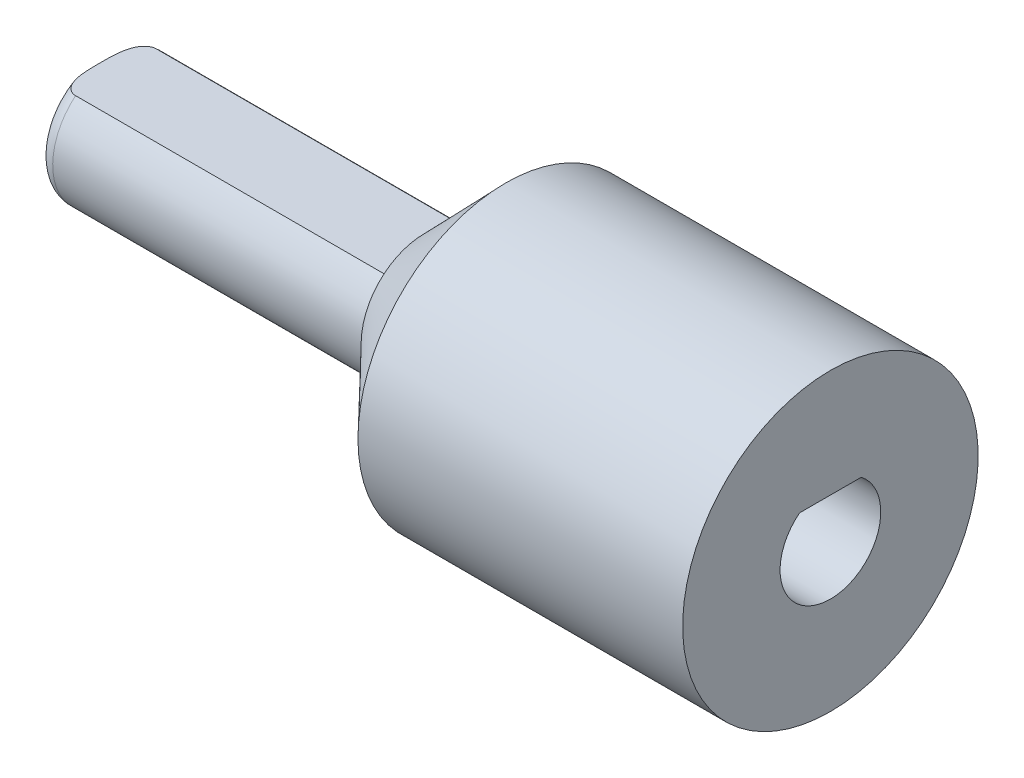
ISO-10303-21;
HEADER;
FILE_DESCRIPTION(('STEP AP214'),'2;1');
FILE_NAME('part.step','',(''),(''),'','','');
FILE_SCHEMA(('AUTOMOTIVE_DESIGN { 1 0 10303 214 1 1 1 1 }'));
ENDSEC;
DATA;
#1=APPLICATION_CONTEXT('core data for automotive mechanical design processes');
#2=APPLICATION_PROTOCOL_DEFINITION('international standard','automotive_design',2000,#1);
#3=PRODUCT_CONTEXT('',#1,'mechanical');
#4=PRODUCT('Part','Part','',(#3));
#5=PRODUCT_RELATED_PRODUCT_CATEGORY('part','',(#4));
#6=PRODUCT_DEFINITION_FORMATION('','',#4);
#7=PRODUCT_DEFINITION_CONTEXT('part definition',#1,'design');
#8=PRODUCT_DEFINITION('design','',#6,#7);
#9=PRODUCT_DEFINITION_SHAPE('','',#8);
#10=(LENGTH_UNIT() NAMED_UNIT(*) SI_UNIT(.MILLI.,.METRE.));
#11=(NAMED_UNIT(*) PLANE_ANGLE_UNIT() SI_UNIT($,.RADIAN.));
#12=(NAMED_UNIT(*) SI_UNIT($,.STERADIAN.) SOLID_ANGLE_UNIT());
#13=UNCERTAINTY_MEASURE_WITH_UNIT(LENGTH_MEASURE(1.E-05),#10,'distance_accuracy_value','');
#14=(GEOMETRIC_REPRESENTATION_CONTEXT(3) GLOBAL_UNCERTAINTY_ASSIGNED_CONTEXT((#13)) GLOBAL_UNIT_ASSIGNED_CONTEXT((#10,
#11,#12)) REPRESENTATION_CONTEXT('',''));
#15=CARTESIAN_POINT('',(0.,0.,0.));
#16=DIRECTION('',(0.,0.,1.));
#17=DIRECTION('',(1.,0.,0.));
#18=AXIS2_PLACEMENT_3D('',#15,#16,#17);
#19=CARTESIAN_POINT('',(30.,0.,0.));
#20=DIRECTION('',(1.,0.,0.));
#21=DIRECTION('',(0.,1.,0.));
#22=AXIS2_PLACEMENT_3D('',#19,#20,#21);
#23=CYLINDRICAL_SURFACE('',#22,9.1);
#24=CARTESIAN_POINT('',(25.,0.,0.));
#25=DIRECTION('',(-1.,0.,0.));
#26=DIRECTION('',(0.,0.,1.));
#27=AXIS2_PLACEMENT_3D('',#24,#25,#26);
#28=CIRCLE('',#27,9.1);
#29=CARTESIAN_POINT('',(25.,0.,9.1));
#30=VERTEX_POINT('',#29);
#31=EDGE_CURVE('E103',#30,#30,#28,.T.);
#32=ORIENTED_EDGE('',*,*,#31,.F.);
#33=EDGE_LOOP('',(#32));
#34=FACE_BOUND('',#33,.T.);
#35=CARTESIAN_POINT('',(45.,0.,0.));
#36=DIRECTION('',(1.,0.,0.));
#37=DIRECTION('',(0.,1.,0.));
#38=AXIS2_PLACEMENT_3D('',#35,#36,#37);
#39=CIRCLE('',#38,9.1);
#40=CARTESIAN_POINT('',(45.,9.1,0.));
#41=VERTEX_POINT('',#40);
#42=EDGE_CURVE('E112',#41,#41,#39,.T.);
#43=ORIENTED_EDGE('',*,*,#42,.F.);
#44=EDGE_LOOP('',(#43));
#45=FACE_BOUND('',#44,.T.);
#46=ADVANCED_FACE('F36',(#34,#45),#23,.T.);
#47=CARTESIAN_POINT('',(45.,9.1,0.));
#48=DIRECTION('',(1.,0.,0.));
#49=DIRECTION('',(0.,1.,0.));
#50=AXIS2_PLACEMENT_3D('',#47,#48,#49);
#51=PLANE('',#50);
#52=ORIENTED_EDGE('',*,*,#42,.T.);
#53=EDGE_LOOP('',(#52));
#54=FACE_BOUND('',#53,.T.);
#55=CARTESIAN_POINT('',(45.,0.,0.));
#56=DIRECTION('',(1.,0.,0.));
#57=DIRECTION('',(0.,1.,0.));
#58=AXIS2_PLACEMENT_3D('',#55,#56,#57);
#59=CIRCLE('',#58,3.1);
#60=CARTESIAN_POINT('',(45.,2.45,1.89934199132226));
#61=VERTEX_POINT('',#60);
#62=CARTESIAN_POINT('',(45.,2.45,-1.89934199132226));
#63=VERTEX_POINT('',#62);
#64=EDGE_CURVE('E110',#61,#63,#59,.T.);
#65=ORIENTED_EDGE('',*,*,#64,.F.);
#66=DIRECTION('',(0.,0.,-1.));
#67=VECTOR('',#66,1.);
#68=CARTESIAN_POINT('',(45.,2.45,0.));
#69=LINE('',#68,#67);
#70=EDGE_CURVE('E233',#61,#63,#69,.T.);
#71=ORIENTED_EDGE('',*,*,#70,.T.);
#72=EDGE_LOOP('',(#65,#71));
#73=FACE_BOUND('',#72,.T.);
#74=ADVANCED_FACE('F135',(#54,#73),#51,.T.);
#75=CARTESIAN_POINT('',(30.,0.,0.));
#76=DIRECTION('',(1.,0.,0.));
#77=DIRECTION('',(0.,1.,0.));
#78=AXIS2_PLACEMENT_3D('',#75,#76,#77);
#79=CYLINDRICAL_SURFACE('',#78,3.1);
#80=DIRECTION('',(1.,0.,0.));
#81=VECTOR('',#80,1.);
#82=CARTESIAN_POINT('',(30.,2.45,-1.89934199132226));
#83=LINE('',#82,#81);
#84=CARTESIAN_POINT('',(32.,2.45,-1.89934199132226));
#85=VERTEX_POINT('',#84);
#86=EDGE_CURVE('E105',#85,#63,#83,.T.);
#87=ORIENTED_EDGE('',*,*,#86,.F.);
#88=CARTESIAN_POINT('',(32.,0.,0.));
#89=DIRECTION('',(1.,0.,0.));
#90=DIRECTION('',(0.,1.,0.));
#91=AXIS2_PLACEMENT_3D('',#88,#89,#90);
#92=CIRCLE('',#91,3.1);
#93=CARTESIAN_POINT('',(32.,2.45,1.89934199132226));
#94=VERTEX_POINT('',#93);
#95=EDGE_CURVE('E86',#94,#85,#92,.T.);
#96=ORIENTED_EDGE('',*,*,#95,.F.);
#97=DIRECTION('',(1.,0.,0.));
#98=VECTOR('',#97,1.);
#99=CARTESIAN_POINT('',(30.,2.45,1.89934199132226));
#100=LINE('',#99,#98);
#101=EDGE_CURVE('E230',#94,#61,#100,.T.);
#102=ORIENTED_EDGE('',*,*,#101,.T.);
#103=ORIENTED_EDGE('',*,*,#64,.T.);
#104=EDGE_LOOP('',(#87,#96,#102,#103));
#105=FACE_BOUND('',#104,.T.);
#106=ADVANCED_FACE('F131',(#105),#79,.F.);
#107=CARTESIAN_POINT('',(30.,0.,0.));
#108=DIRECTION('',(1.,0.,0.));
#109=DIRECTION('',(0.,1.,0.));
#110=AXIS2_PLACEMENT_3D('',#107,#108,#109);
#111=CONICAL_SURFACE('',#110,0.,0.99783018390619);
#112=CARTESIAN_POINT('',(33.0822640835354,2.45,-4.10147478271747));
#113=CARTESIAN_POINT('',(33.0222688677766,2.45,-3.99312986839187));
#114=CARTESIAN_POINT('',(32.9627306009875,2.45,-3.8845282987026));
#115=CARTESIAN_POINT('',(32.8448205756611,2.45,-3.6666756285392));
#116=CARTESIAN_POINT('',(32.7864489735671,2.45,-3.55742444347025));
#117=CARTESIAN_POINT('',(32.6708557619406,2.45,-3.33762271938319));
#118=CARTESIAN_POINT('',(32.6136412709603,2.45,-3.22706842601533));
#119=CARTESIAN_POINT('',(32.5010341367918,2.45,-3.00503961424674));
#120=CARTESIAN_POINT('',(32.4456414122943,2.45,-2.89356513719434));
#121=CARTESIAN_POINT('',(32.3342808959826,2.45,-2.66354856217289));
#122=CARTESIAN_POINT('',(32.278438649272,2.45,-2.54494539399226));
#123=CARTESIAN_POINT('',(32.1700719990868,2.45,-2.30620559226578));
#124=CARTESIAN_POINT('',(32.1175480102689,2.45,-2.18606876931704));
#125=CARTESIAN_POINT('',(32.0169715815761,2.45,-1.94417832466583));
#126=CARTESIAN_POINT('',(31.9689111702574,2.45,-1.82242804693643));
#127=CARTESIAN_POINT('',(31.878589653929,2.45,-1.57681280661028));
#128=CARTESIAN_POINT('',(31.8363266591773,2.45,-1.4529485479665));
#129=CARTESIAN_POINT('',(31.7597812932428,2.45,-1.20395056942792));
#130=CARTESIAN_POINT('',(31.725430859707,2.45,-1.078838143254));
#131=CARTESIAN_POINT('',(31.6664026914298,2.45,-0.826324571779752));
#132=CARTESIAN_POINT('',(31.6417228047462,2.45,-0.698923942269424));
#133=CARTESIAN_POINT('',(31.6045231123367,2.45,-0.444676455427156));
#134=CARTESIAN_POINT('',(31.5917902181542,2.45,-0.317861701479688));
#135=CARTESIAN_POINT('',(31.5790642068831,2.45,-0.0635809316517888));
#136=CARTESIAN_POINT('',(31.5790700608916,2.45,0.0638850307992146));
#137=CARTESIAN_POINT('',(31.5916066020238,2.45,0.31401105716441));
#138=CARTESIAN_POINT('',(31.6037293193037,2.45,0.436692424349663));
#139=CARTESIAN_POINT('',(31.6386863915768,2.45,0.680494355124752));
#140=CARTESIAN_POINT('',(31.6615224924699,2.45,0.801614661010436));
#141=CARTESIAN_POINT('',(31.7166878493983,2.45,1.04448136496026));
#142=CARTESIAN_POINT('',(31.7492177589699,2.45,1.16618131676199));
#143=CARTESIAN_POINT('',(31.8034757304785,2.45,1.34704782635168));
#144=CARTESIAN_POINT('',(31.8224730282286,2.45,1.40705824269581));
#145=CARTESIAN_POINT('',(31.8620715478989,2.45,1.52654442864439));
#146=CARTESIAN_POINT('',(31.8826726707678,2.45,1.58602023101365));
#147=CARTESIAN_POINT('',(31.9527901085688,2.45,1.78098246293056));
#148=CARTESIAN_POINT('',(32.0052785289622,2.45,1.91540144127997));
#149=CARTESIAN_POINT('',(32.1156276473026,2.45,2.18202911662332));
#150=CARTESIAN_POINT('',(32.173490079192,2.45,2.31423708387693));
#151=CARTESIAN_POINT('',(32.2932459991395,2.45,2.57698302872711));
#152=CARTESIAN_POINT('',(32.3551439214728,2.45,2.70751897408673));
#153=CARTESIAN_POINT('',(32.4819078590821,2.45,2.96711409808928));
#154=CARTESIAN_POINT('',(32.5467735253491,2.45,3.09617344816079));
#155=CARTESIAN_POINT('',(32.6790677365007,2.45,3.35370051962677));
#156=CARTESIAN_POINT('',(32.746506478066,2.45,3.48216298536282));
#157=CARTESIAN_POINT('',(32.8831604194306,2.45,3.73814112019863));
#158=CARTESIAN_POINT('',(32.9523756667965,2.45,3.86565676382887));
#159=CARTESIAN_POINT('',(33.1620057351369,2.45,4.2469006947162));
#160=CARTESIAN_POINT('',(33.3044903683454,2.45,4.49948978674318));
#161=CARTESIAN_POINT('',(33.5742555844649,2.45,4.96991913905333));
#162=CARTESIAN_POINT('',(33.7011050416119,2.45,5.18800847034171));
#163=CARTESIAN_POINT('',(33.9567648838639,2.45,5.62308489450393));
#164=CARTESIAN_POINT('',(34.0855756042172,2.45,5.84007179028362));
#165=CARTESIAN_POINT('',(34.3434867978673,2.45,6.27130493320179));
#166=CARTESIAN_POINT('',(34.4725749366151,2.45,6.48555857396541));
#167=CARTESIAN_POINT('',(34.73180419028,2.45,6.91336786895846));
#168=CARTESIAN_POINT('',(34.8619450826231,2.45,7.12692365798186));
#169=CARTESIAN_POINT('',(34.9924679583633,2.45,7.34024379686871));
#170=B_SPLINE_CURVE_WITH_KNOTS('',3,(#112,#113,#114,#115,#116,#117,#118,#119,#120,#121,#122,
#123,#124,#125,#126,#127,#128,#129,#130,#131,#132,#133,#134,#135,#136,#137,#138,#139,#140,#141,
#142,#143,#144,#145,#146,#147,#148,#149,#150,#151,#152,#153,#154,#155,#156,#157,#158,#159,#160,
#161,#162,#163,#164,#165,#166,#167,#168,#169),.UNSPECIFIED.,.F.,.F.,(4,2,2,2,2,2,2,2,2,2,2,2,2,
2,2,2,2,2,2,2,2,2,2,2,2,2,2,2,4),(0.,0.371544220243284,0.743137932664901,1.11657013896955,
1.48998565550802,1.88322216822695,2.27650772382364,2.66907683766718,3.06151768295924,
3.45044503407035,3.83928578976136,4.22105137183573,4.60278611888081,4.97208685640307,
5.3414477977075,5.71905910247918,5.90787847437289,6.09668619412545,6.52941492948073,
6.96228377446339,7.39563655329309,7.8289384998656,8.26418532763144,8.69944382142602,
9.56940663931012,10.3262877546752,11.0832997331682,11.8337065858408,12.5839587306215),.UNSPECIFIED.);
#171=EDGE_CURVE('E115',#94,#85,#170,.F.);
#172=ORIENTED_EDGE('',*,*,#171,.F.);
#173=ORIENTED_EDGE('',*,*,#95,.T.);
#174=EDGE_LOOP('',(#172,#173));
#175=FACE_BOUND('',#174,.T.);
#176=CARTESIAN_POINT('',(30.,0.,0.));
#177=VERTEX_POINT('',#176);
#178=VERTEX_LOOP('',#177);
#179=FACE_BOUND('',#178,.T.);
#180=ADVANCED_FACE('F127',(#175,#179),#111,.F.);
#181=CARTESIAN_POINT('',(25.,0.,0.));
#182=DIRECTION('',(1.,0.,0.));
#183=DIRECTION('',(0.,0.,-1.));
#184=AXIS2_PLACEMENT_3D('',#181,#182,#183);
#185=CONICAL_SURFACE('',#184,9.1,0.805003494254653);
#186=CARTESIAN_POINT('',(20.,0.,0.));
#187=DIRECTION('',(-1.,0.,0.));
#188=DIRECTION('',(0.,0.,1.));
#189=AXIS2_PLACEMENT_3D('',#186,#187,#188);
#190=CIRCLE('',#189,3.9);
#191=CARTESIAN_POINT('',(20.,3.,2.49198715887542));
#192=VERTEX_POINT('',#191);
#193=CARTESIAN_POINT('',(20.,3.,-2.49198715887542));
#194=VERTEX_POINT('',#193);
#195=EDGE_CURVE('E80',#192,#194,#190,.T.);
#196=ORIENTED_EDGE('',*,*,#195,.F.);
#197=EDGE_CURVE('E87',#194,#192,#190,.T.);
#198=ORIENTED_EDGE('',*,*,#197,.F.);
#199=EDGE_LOOP('',(#196,#198));
#200=FACE_BOUND('',#199,.T.);
#201=ORIENTED_EDGE('',*,*,#31,.T.);
#202=EDGE_LOOP('',(#201));
#203=FACE_BOUND('',#202,.T.);
#204=ADVANCED_FACE('F101',(#200,#203),#185,.T.);
#205=CARTESIAN_POINT('',(0.,0.,0.));
#206=DIRECTION('',(-1.,0.,0.));
#207=DIRECTION('',(0.,-1.,0.));
#208=AXIS2_PLACEMENT_3D('',#205,#206,#207);
#209=PLANE('',#208);
#210=CARTESIAN_POINT('',(0.,0.,0.));
#211=DIRECTION('',(-1.,0.,0.));
#212=DIRECTION('',(0.,-1.,0.));
#213=AXIS2_PLACEMENT_3D('',#210,#211,#212);
#214=CIRCLE('',#213,2.9);
#215=CARTESIAN_POINT('',(0.,2.23076923076923,1.85301609249711));
#216=VERTEX_POINT('',#215);
#217=EDGE_CURVE('E12',#216,#216,#214,.T.);
#218=ORIENTED_EDGE('',*,*,#217,.T.);
#219=EDGE_LOOP('',(#218));
#220=FACE_BOUND('',#219,.T.);
#221=ADVANCED_FACE('F144',(#220),#209,.T.);
#222=CARTESIAN_POINT('',(30.,0.,0.));
#223=DIRECTION('',(1.,0.,0.));
#224=DIRECTION('',(0.,1.,0.));
#225=AXIS2_PLACEMENT_3D('',#222,#223,#224);
#226=CYLINDRICAL_SURFACE('',#225,3.9);
#227=DIRECTION('',(-1.,0.,0.));
#228=VECTOR('',#227,1.);
#229=CARTESIAN_POINT('',(20.,3.,2.49198715887542));
#230=LINE('',#229,#228);
#231=CARTESIAN_POINT('',(1.00000000000001,3.,2.49198715887542));
#232=VERTEX_POINT('',#231);
#233=EDGE_CURVE('E92',#192,#232,#230,.T.);
#234=ORIENTED_EDGE('',*,*,#233,.T.);
#235=CARTESIAN_POINT('',(1.,0.,0.));
#236=DIRECTION('',(-1.,0.,0.));
#237=DIRECTION('',(0.,-1.,0.));
#238=AXIS2_PLACEMENT_3D('',#235,#236,#237);
#239=CIRCLE('',#238,3.9);
#240=CARTESIAN_POINT('',(1.,3.,-2.49198715887542));
#241=VERTEX_POINT('',#240);
#242=EDGE_CURVE('E99',#232,#241,#239,.F.);
#243=ORIENTED_EDGE('',*,*,#242,.T.);
#244=DIRECTION('',(-1.,0.,0.));
#245=VECTOR('',#244,1.);
#246=CARTESIAN_POINT('',(20.,3.,-2.49198715887542));
#247=LINE('',#246,#245);
#248=EDGE_CURVE('E91',#194,#241,#247,.T.);
#249=ORIENTED_EDGE('',*,*,#248,.F.);
#250=ORIENTED_EDGE('',*,*,#197,.T.);
#251=EDGE_LOOP('',(#234,#243,#249,#250));
#252=FACE_BOUND('',#251,.T.);
#253=ADVANCED_FACE('F97',(#252),#226,.T.);
#254=CARTESIAN_POINT('',(30.,2.45,0.));
#255=DIRECTION('',(0.,-1.,0.));
#256=DIRECTION('',(1.,0.,0.));
#257=AXIS2_PLACEMENT_3D('',#254,#255,#256);
#258=PLANE('',#257);
#259=ORIENTED_EDGE('',*,*,#101,.F.);
#260=ORIENTED_EDGE('',*,*,#171,.T.);
#261=ORIENTED_EDGE('',*,*,#86,.T.);
#262=ORIENTED_EDGE('',*,*,#70,.F.);
#263=EDGE_LOOP('',(#259,#260,#261,#262));
#264=FACE_BOUND('',#263,.T.);
#265=ADVANCED_FACE('F123',(#264),#258,.T.);
#266=CARTESIAN_POINT('',(20.,3.,0.));
#267=DIRECTION('',(0.,-1.,0.));
#268=DIRECTION('',(1.,0.,0.));
#269=AXIS2_PLACEMENT_3D('',#266,#267,#268);
#270=PLANE('',#269);
#271=ORIENTED_EDGE('',*,*,#248,.T.);
#272=CARTESIAN_POINT('',(1.,3.,-2.49198715887542));
#273=CARTESIAN_POINT('',(0.979437917066557,3.,-2.49199074908237));
#274=CARTESIAN_POINT('',(0.958888814998611,3.,-2.49099373140729));
#275=CARTESIAN_POINT('',(0.917994865450589,3.,-2.48704238105869));
#276=CARTESIAN_POINT('',(0.897649875785505,3.,-2.48408952317974));
#277=CARTESIAN_POINT('',(0.837544087010761,3.,-2.4724386741567));
#278=CARTESIAN_POINT('',(0.798295967720155,3.,-2.4609463788786));
#279=CARTESIAN_POINT('',(0.722548844750251,3.,-2.43137022451434));
#280=CARTESIAN_POINT('',(0.686043176827645,3.,-2.4133030119175));
#281=CARTESIAN_POINT('',(0.61625472921864,3.,-2.37164690432703));
#282=CARTESIAN_POINT('',(0.582980294444992,3.,-2.34804422312281));
#283=CARTESIAN_POINT('',(0.50771551307762,3.,-2.2863447218251));
#284=CARTESIAN_POINT('',(0.467415212093755,3.,-2.24619160640654));
#285=CARTESIAN_POINT('',(0.393774021944655,3.,-2.1600346337248));
#286=CARTESIAN_POINT('',(0.360441064096966,3.,-2.1140242035503));
#287=CARTESIAN_POINT('',(0.283263395287344,3.,-1.99130997148751));
#288=CARTESIAN_POINT('',(0.243910917939652,3.,-1.9117891040102));
#289=CARTESIAN_POINT('',(0.194127269269301,3.,-1.78892001673169));
#290=CARTESIAN_POINT('',(0.179053748581202,3.,-1.74728303542987));
#291=CARTESIAN_POINT('',(0.151620527749575,3.,-1.66314386708564));
#292=CARTESIAN_POINT('',(0.139258898604387,3.,-1.62064231868932));
#293=CARTESIAN_POINT('',(0.105803959623038,3.,-1.49267822291249));
#294=CARTESIAN_POINT('',(0.0881733722749255,3.,-1.40631769721909));
#295=CARTESIAN_POINT('',(0.059656156136683,3.,-1.23246194549841));
#296=CARTESIAN_POINT('',(0.0487783321822203,3.,-1.14496538925196));
#297=CARTESIAN_POINT('',(0.0316743111337259,3.,-0.969109733775322));
#298=CARTESIAN_POINT('',(0.0254713470900518,3.,-0.880748508809643));
#299=CARTESIAN_POINT('',(0.0161169494450636,3.,-0.703924434876694));
#300=CARTESIAN_POINT('',(0.0129641059901421,3.,-0.615461651802371));
#301=CARTESIAN_POINT('',(0.00842194096114439,3.,-0.437518731346362));
#302=CARTESIAN_POINT('',(0.00705249630878828,3.,-0.348038156302517));
#303=CARTESIAN_POINT('',(0.00533366615670855,3.,-0.169060768438579));
#304=CARTESIAN_POINT('',(0.00498437851648339,3.,-0.0795639548842401));
#305=CARTESIAN_POINT('',(0.00504397578743107,3.,0.099198592781009));
#306=CARTESIAN_POINT('',(0.00545090711784649,3.,0.188464327405021));
#307=CARTESIAN_POINT('',(0.00731992079293353,3.,0.366980738617853));
#308=CARTESIAN_POINT('',(0.00878192798468802,3.,0.456231415826332));
#309=CARTESIAN_POINT('',(0.0135574955979064,3.,0.633138430933189));
#310=CARTESIAN_POINT('',(0.0168384486940873,3.,0.720795530319391));
#311=CARTESIAN_POINT('',(0.0264853263207332,3.,0.896031155333023));
#312=CARTESIAN_POINT('',(0.0328538048787363,3.,0.983609555665509));
#313=CARTESIAN_POINT('',(0.050266840890535,3.,1.15751748061158));
#314=CARTESIAN_POINT('',(0.0612679354359268,3.,1.24385108947597));
#315=CARTESIAN_POINT('',(0.0899463218150543,3.,1.41536688968294));
#316=CARTESIAN_POINT('',(0.107615081971484,3.,1.50055040896489));
#317=CARTESIAN_POINT('',(0.146669231095486,3.,1.64820346348317));
#318=CARTESIAN_POINT('',(0.166116650863163,3.,1.71117536728164));
#319=CARTESIAN_POINT('',(0.211520968555934,3.,1.83497495196133));
#320=CARTESIAN_POINT('',(0.237494329621938,3.,1.89579675928035));
#321=CARTESIAN_POINT('',(0.297524247389423,3.,2.01417228668545));
#322=CARTESIAN_POINT('',(0.33165944793902,3.,2.07168700086469));
#323=CARTESIAN_POINT('',(0.409094770325379,3.,2.18018334756639));
#324=CARTESIAN_POINT('',(0.45236778806861,3.,2.23118360035581));
#325=CARTESIAN_POINT('',(0.53183319782646,3.,2.30696749995848));
#326=CARTESIAN_POINT('',(0.565220199658296,3.,2.33468649236293));
#327=CARTESIAN_POINT('',(0.635959596352868,3.,2.38453009627015));
#328=CARTESIAN_POINT('',(0.67330857079297,3.,2.40665947843423));
#329=CARTESIAN_POINT('',(0.75174642281722,3.,2.44412818192181));
#330=CARTESIAN_POINT('',(0.792866574591728,3.,2.45940309492613));
#331=CARTESIAN_POINT('',(0.877319727000598,3.,2.48160845365469));
#332=CARTESIAN_POINT('',(0.920651518813619,3.,2.48854340791853));
#333=CARTESIAN_POINT('',(1.00201788076434,3.,2.49310310363993));
#334=CARTESIAN_POINT('',(1.03999004205071,3.,2.49184396195571));
#335=CARTESIAN_POINT('',(1.09636599705739,3.,2.48498076077513));
#336=CARTESIAN_POINT('',(1.11510118817528,3.,2.48185163831054));
#337=CARTESIAN_POINT('',(1.15223135373725,3.,2.47398792975904));
#338=CARTESIAN_POINT('',(1.17062634156857,3.,2.46925340698816));
#339=CARTESIAN_POINT('',(1.18879363205739,3.,2.46374802140656));
#340=B_SPLINE_CURVE_WITH_KNOTS('',3,(#272,#273,#274,#275,#276,#277,#278,#279,#280,#281,#282,
#283,#284,#285,#286,#287,#288,#289,#290,#291,#292,#293,#294,#295,#296,#297,#298,#299,#300,#301,
#302,#303,#304,#305,#306,#307,#308,#309,#310,#311,#312,#313,#314,#315,#316,#317,#318,#319,#320,
#321,#322,#323,#324,#325,#326,#327,#328,#329,#330,#331,#332,#333,#334,#335,#336,#337,#338,#339),
.UNSPECIFIED.,.F.,.F.,(4,2,2,2,2,2,2,2,2,2,2,2,2,2,2,2,2,2,2,2,2,2,2,2,2,2,2,2,2,2,2,2,2,4),(0.,
0.0616374518081734,0.123228478939569,0.245181256225875,0.366827395364757,0.488779776008221,
0.658492529908949,0.828397437679628,1.0929761521089,1.22577177379428,1.3584726278317,
1.62247526389735,1.88682141031959,2.15247279101791,2.41800132124218,2.68646467099402,
2.95495377249361,3.22275023580258,3.49052762588663,3.75365305642327,4.01699651891515,
4.27792249846674,4.53851573348437,4.73596490007328,4.93391726721676,5.13385987003459,
5.3332175414409,5.46294913234716,5.59256962197957,5.72338382184634,5.85412727238185,
5.96747254467012,6.02439422577081,6.081313662175),.UNSPECIFIED.);
#341=EDGE_CURVE('E45',#241,#232,#340,.T.);
#342=ORIENTED_EDGE('',*,*,#341,.T.);
#343=ORIENTED_EDGE('',*,*,#233,.F.);
#344=DIRECTION('',(0.,0.,1.));
#345=VECTOR('',#344,1.);
#346=CARTESIAN_POINT('',(20.,3.,0.));
#347=LINE('',#346,#345);
#348=EDGE_CURVE('E83',#194,#192,#347,.T.);
#349=ORIENTED_EDGE('',*,*,#348,.F.);
#350=EDGE_LOOP('',(#271,#342,#343,#349));
#351=FACE_BOUND('',#350,.T.);
#352=ADVANCED_FACE('F90',(#351),#270,.F.);
#353=CARTESIAN_POINT('',(20.,0.,0.));
#354=DIRECTION('',(-1.,0.,0.));
#355=DIRECTION('',(0.,-1.,0.));
#356=AXIS2_PLACEMENT_3D('',#353,#354,#355);
#357=PLANE('',#356);
#358=ORIENTED_EDGE('',*,*,#195,.T.);
#359=ORIENTED_EDGE('',*,*,#348,.T.);
#360=EDGE_LOOP('',(#358,#359));
#361=FACE_BOUND('',#360,.T.);
#362=ADVANCED_FACE('F82',(#361),#357,.T.);
#363=CARTESIAN_POINT('',(1.,0.,0.));
#364=DIRECTION('',(-1.,0.,0.));
#365=DIRECTION('',(0.,-1.,0.));
#366=AXIS2_PLACEMENT_3D('',#363,#364,#365);
#367=TOROIDAL_SURFACE('',#366,2.9,1.);
#368=ORIENTED_EDGE('',*,*,#217,.F.);
#369=EDGE_LOOP('',(#368));
#370=FACE_BOUND('',#369,.T.);
#371=ORIENTED_EDGE('',*,*,#341,.F.);
#372=ORIENTED_EDGE('',*,*,#242,.F.);
#373=EDGE_LOOP('',(#371,#372));
#374=FACE_BOUND('',#373,.T.);
#375=ADVANCED_FACE('F38',(#370,#374),#367,.T.);
#376=CLOSED_SHELL('',(#46,#74,#106,#180,#204,#221,#253,#265,#352,#362,#375));
#377=MANIFOLD_SOLID_BREP('B2',#376);
#378=ADVANCED_BREP_SHAPE_REPRESENTATION('',(#18,#377),#14);
#379=SHAPE_DEFINITION_REPRESENTATION(#9,#378);
ENDSEC;
END-ISO-10303-21;
